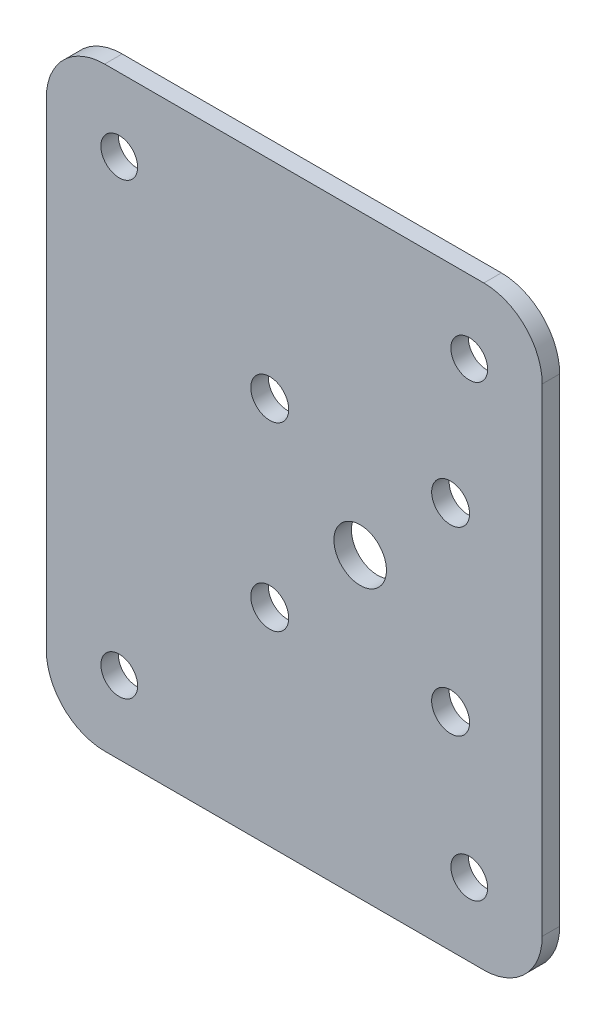
ISO-10303-21;
HEADER;
FILE_DESCRIPTION(('STEP AP214'),'2;1');
FILE_NAME('part.step','',(''),(''),'','','');
FILE_SCHEMA(('AUTOMOTIVE_DESIGN { 1 0 10303 214 1 1 1 1 }'));
ENDSEC;
DATA;
#1=APPLICATION_CONTEXT('core data for automotive mechanical design processes');
#2=APPLICATION_PROTOCOL_DEFINITION('international standard','automotive_design',2000,#1);
#3=PRODUCT_CONTEXT('',#1,'mechanical');
#4=PRODUCT('Part','Part','',(#3));
#5=PRODUCT_RELATED_PRODUCT_CATEGORY('part','',(#4));
#6=PRODUCT_DEFINITION_FORMATION('','',#4);
#7=PRODUCT_DEFINITION_CONTEXT('part definition',#1,'design');
#8=PRODUCT_DEFINITION('design','',#6,#7);
#9=PRODUCT_DEFINITION_SHAPE('','',#8);
#10=(LENGTH_UNIT() NAMED_UNIT(*) SI_UNIT(.MILLI.,.METRE.));
#11=(NAMED_UNIT(*) PLANE_ANGLE_UNIT() SI_UNIT($,.RADIAN.));
#12=(NAMED_UNIT(*) SI_UNIT($,.STERADIAN.) SOLID_ANGLE_UNIT());
#13=UNCERTAINTY_MEASURE_WITH_UNIT(LENGTH_MEASURE(1.E-05),#10,'distance_accuracy_value','');
#14=(GEOMETRIC_REPRESENTATION_CONTEXT(3) GLOBAL_UNCERTAINTY_ASSIGNED_CONTEXT((#13)) GLOBAL_UNIT_ASSIGNED_CONTEXT((#10,
#11,#12)) REPRESENTATION_CONTEXT('',''));
#15=CARTESIAN_POINT('',(0.,0.,0.));
#16=DIRECTION('',(0.,0.,1.));
#17=DIRECTION('',(1.,0.,0.));
#18=AXIS2_PLACEMENT_3D('',#15,#16,#17);
#19=CARTESIAN_POINT('',(0.,0.,3.));
#20=DIRECTION('',(0.,0.,1.));
#21=DIRECTION('',(1.,0.,0.));
#22=AXIS2_PLACEMENT_3D('',#19,#20,#21);
#23=PLANE('',#22);
#24=CARTESIAN_POINT('',(18.7,-38.5,3.));
#25=DIRECTION('',(0.,0.,1.));
#26=DIRECTION('',(-1.,0.,0.));
#27=AXIS2_PLACEMENT_3D('',#24,#25,#26);
#28=CIRCLE('',#27,3.15);
#29=CARTESIAN_POINT('',(15.55,-38.5,3.));
#30=VERTEX_POINT('',#29);
#31=EDGE_CURVE('E233',#30,#30,#28,.T.);
#32=ORIENTED_EDGE('',*,*,#31,.F.);
#33=EDGE_LOOP('',(#32));
#34=FACE_BOUND('',#33,.T.);
#35=CARTESIAN_POINT('',(-41.3,38.5,3.));
#36=DIRECTION('',(0.,0.,1.));
#37=DIRECTION('',(1.,0.,0.));
#38=AXIS2_PLACEMENT_3D('',#35,#36,#37);
#39=CIRCLE('',#38,3.15);
#40=CARTESIAN_POINT('',(-38.15,38.5,3.));
#41=VERTEX_POINT('',#40);
#42=EDGE_CURVE('E221',#41,#41,#39,.T.);
#43=ORIENTED_EDGE('',*,*,#42,.F.);
#44=EDGE_LOOP('',(#43));
#45=FACE_BOUND('',#44,.T.);
#46=CARTESIAN_POINT('',(15.5,-15.5,3.));
#47=DIRECTION('',(0.,0.,1.));
#48=DIRECTION('',(-1.,0.,0.));
#49=AXIS2_PLACEMENT_3D('',#46,#47,#48);
#50=CIRCLE('',#49,3.25);
#51=CARTESIAN_POINT('',(12.25,-15.5,3.));
#52=VERTEX_POINT('',#51);
#53=EDGE_CURVE('E209',#52,#52,#50,.T.);
#54=ORIENTED_EDGE('',*,*,#53,.F.);
#55=EDGE_LOOP('',(#54));
#56=FACE_BOUND('',#55,.T.);
#57=CARTESIAN_POINT('',(15.5,15.5,3.));
#58=DIRECTION('',(0.,0.,1.));
#59=DIRECTION('',(1.,0.,0.));
#60=AXIS2_PLACEMENT_3D('',#57,#58,#59);
#61=CIRCLE('',#60,3.25);
#62=CARTESIAN_POINT('',(18.75,15.5,3.));
#63=VERTEX_POINT('',#62);
#64=EDGE_CURVE('E197',#63,#63,#61,.T.);
#65=ORIENTED_EDGE('',*,*,#64,.F.);
#66=EDGE_LOOP('',(#65));
#67=FACE_BOUND('',#66,.T.);
#68=DIRECTION('',(0.,-1.,0.));
#69=VECTOR('',#68,1.);
#70=CARTESIAN_POINT('',(-53.8,51.,3.));
#71=LINE('',#70,#69);
#72=CARTESIAN_POINT('',(-53.8,41.,3.));
#73=VERTEX_POINT('',#72);
#74=CARTESIAN_POINT('',(-53.8,-41.,3.));
#75=VERTEX_POINT('',#74);
#76=EDGE_CURVE('E151',#73,#75,#71,.T.);
#77=ORIENTED_EDGE('',*,*,#76,.T.);
#78=CARTESIAN_POINT('',(-43.8,-41.,3.));
#79=DIRECTION('',(0.,0.,1.));
#80=DIRECTION('',(1.,0.,0.));
#81=AXIS2_PLACEMENT_3D('',#78,#79,#80);
#82=CIRCLE('',#81,10.);
#83=CARTESIAN_POINT('',(-43.8,-51.,3.));
#84=VERTEX_POINT('',#83);
#85=EDGE_CURVE('E165',#75,#84,#82,.T.);
#86=ORIENTED_EDGE('',*,*,#85,.T.);
#87=DIRECTION('',(1.,0.,0.));
#88=VECTOR('',#87,1.);
#89=CARTESIAN_POINT('',(-53.8,-51.,3.));
#90=LINE('',#89,#88);
#91=CARTESIAN_POINT('',(21.2,-51.,3.));
#92=VERTEX_POINT('',#91);
#93=EDGE_CURVE('E132',#84,#92,#90,.T.);
#94=ORIENTED_EDGE('',*,*,#93,.T.);
#95=CARTESIAN_POINT('',(21.2,-41.,3.));
#96=DIRECTION('',(0.,0.,1.));
#97=DIRECTION('',(1.,0.,0.));
#98=AXIS2_PLACEMENT_3D('',#95,#96,#97);
#99=CIRCLE('',#98,10.);
#100=CARTESIAN_POINT('',(31.2,-41.,3.));
#101=VERTEX_POINT('',#100);
#102=EDGE_CURVE('E161',#92,#101,#99,.T.);
#103=ORIENTED_EDGE('',*,*,#102,.T.);
#104=DIRECTION('',(0.,1.,0.));
#105=VECTOR('',#104,1.);
#106=CARTESIAN_POINT('',(31.2,51.,3.));
#107=LINE('',#106,#105);
#108=CARTESIAN_POINT('',(31.2,41.,3.));
#109=VERTEX_POINT('',#108);
#110=EDGE_CURVE('E174',#101,#109,#107,.T.);
#111=ORIENTED_EDGE('',*,*,#110,.T.);
#112=CARTESIAN_POINT('',(21.2,41.,3.));
#113=DIRECTION('',(0.,0.,1.));
#114=DIRECTION('',(1.,0.,0.));
#115=AXIS2_PLACEMENT_3D('',#112,#113,#114);
#116=CIRCLE('',#115,10.);
#117=CARTESIAN_POINT('',(21.2,51.,3.));
#118=VERTEX_POINT('',#117);
#119=EDGE_CURVE('E67',#109,#118,#116,.T.);
#120=ORIENTED_EDGE('',*,*,#119,.T.);
#121=DIRECTION('',(-1.,0.,0.));
#122=VECTOR('',#121,1.);
#123=CARTESIAN_POINT('',(-53.8,51.,3.));
#124=LINE('',#123,#122);
#125=CARTESIAN_POINT('',(-43.8,51.,3.));
#126=VERTEX_POINT('',#125);
#127=EDGE_CURVE('E152',#118,#126,#124,.T.);
#128=ORIENTED_EDGE('',*,*,#127,.T.);
#129=CARTESIAN_POINT('',(-43.8,41.,3.));
#130=DIRECTION('',(0.,0.,1.));
#131=DIRECTION('',(1.,0.,0.));
#132=AXIS2_PLACEMENT_3D('',#129,#130,#131);
#133=CIRCLE('',#132,10.);
#134=EDGE_CURVE('E163',#126,#73,#133,.T.);
#135=ORIENTED_EDGE('',*,*,#134,.T.);
#136=EDGE_LOOP('',(#77,#86,#94,#103,#111,#120,#128,#135));
#137=FACE_BOUND('',#136,.T.);
#138=CARTESIAN_POINT('',(0.,0.,3.));
#139=DIRECTION('',(0.,0.,1.));
#140=DIRECTION('',(1.,0.,0.));
#141=AXIS2_PLACEMENT_3D('',#138,#139,#140);
#142=CIRCLE('',#141,4.5);
#143=CARTESIAN_POINT('',(4.5,0.,3.));
#144=VERTEX_POINT('',#143);
#145=EDGE_CURVE('E146',#144,#144,#142,.T.);
#146=ORIENTED_EDGE('',*,*,#145,.F.);
#147=EDGE_LOOP('',(#146));
#148=FACE_BOUND('',#147,.T.);
#149=CARTESIAN_POINT('',(-15.5,15.5,3.));
#150=DIRECTION('',(0.,0.,1.));
#151=DIRECTION('',(-1.,0.,0.));
#152=AXIS2_PLACEMENT_3D('',#149,#150,#151);
#153=CIRCLE('',#152,3.25);
#154=CARTESIAN_POINT('',(-18.75,15.5,3.));
#155=VERTEX_POINT('',#154);
#156=EDGE_CURVE('E203',#155,#155,#153,.T.);
#157=ORIENTED_EDGE('',*,*,#156,.F.);
#158=EDGE_LOOP('',(#157));
#159=FACE_BOUND('',#158,.T.);
#160=CARTESIAN_POINT('',(-15.5,-15.5,3.));
#161=DIRECTION('',(0.,0.,1.));
#162=DIRECTION('',(1.,0.,0.));
#163=AXIS2_PLACEMENT_3D('',#160,#161,#162);
#164=CIRCLE('',#163,3.25);
#165=CARTESIAN_POINT('',(-12.25,-15.5,3.));
#166=VERTEX_POINT('',#165);
#167=EDGE_CURVE('E215',#166,#166,#164,.T.);
#168=ORIENTED_EDGE('',*,*,#167,.F.);
#169=EDGE_LOOP('',(#168));
#170=FACE_BOUND('',#169,.T.);
#171=CARTESIAN_POINT('',(18.7,38.5,3.));
#172=DIRECTION('',(0.,0.,1.));
#173=DIRECTION('',(1.,0.,0.));
#174=AXIS2_PLACEMENT_3D('',#171,#172,#173);
#175=CIRCLE('',#174,3.15);
#176=CARTESIAN_POINT('',(21.85,38.5,3.));
#177=VERTEX_POINT('',#176);
#178=EDGE_CURVE('E227',#177,#177,#175,.T.);
#179=ORIENTED_EDGE('',*,*,#178,.F.);
#180=EDGE_LOOP('',(#179));
#181=FACE_BOUND('',#180,.T.);
#182=CARTESIAN_POINT('',(-41.3,-38.5,3.));
#183=DIRECTION('',(0.,0.,1.));
#184=DIRECTION('',(-1.,0.,0.));
#185=AXIS2_PLACEMENT_3D('',#182,#183,#184);
#186=CIRCLE('',#185,3.15);
#187=CARTESIAN_POINT('',(-44.45,-38.5,3.));
#188=VERTEX_POINT('',#187);
#189=EDGE_CURVE('E239',#188,#188,#186,.T.);
#190=ORIENTED_EDGE('',*,*,#189,.F.);
#191=EDGE_LOOP('',(#190));
#192=FACE_BOUND('',#191,.T.);
#193=ADVANCED_FACE('F45',(#34,#45,#56,#67,#137,#148,#159,#170,#181,#192),#23,.T.);
#194=CARTESIAN_POINT('',(0.,0.,0.));
#195=DIRECTION('',(0.,0.,1.));
#196=DIRECTION('',(1.,0.,0.));
#197=AXIS2_PLACEMENT_3D('',#194,#195,#196);
#198=PLANE('',#197);
#199=DIRECTION('',(1.,0.,0.));
#200=VECTOR('',#199,1.);
#201=CARTESIAN_POINT('',(-53.8,-51.,0.));
#202=LINE('',#201,#200);
#203=CARTESIAN_POINT('',(-43.8,-51.,0.));
#204=VERTEX_POINT('',#203);
#205=CARTESIAN_POINT('',(21.2,-51.,0.));
#206=VERTEX_POINT('',#205);
#207=EDGE_CURVE('E129',#204,#206,#202,.T.);
#208=ORIENTED_EDGE('',*,*,#207,.F.);
#209=CARTESIAN_POINT('',(-43.8,-41.,0.));
#210=DIRECTION('',(0.,0.,1.));
#211=DIRECTION('',(1.,0.,0.));
#212=AXIS2_PLACEMENT_3D('',#209,#210,#211);
#213=CIRCLE('',#212,10.);
#214=CARTESIAN_POINT('',(-53.8,-41.,0.));
#215=VERTEX_POINT('',#214);
#216=EDGE_CURVE('E112',#204,#215,#213,.F.);
#217=ORIENTED_EDGE('',*,*,#216,.T.);
#218=DIRECTION('',(0.,-1.,0.));
#219=VECTOR('',#218,1.);
#220=CARTESIAN_POINT('',(-53.8,51.,0.));
#221=LINE('',#220,#219);
#222=CARTESIAN_POINT('',(-53.8,41.,0.));
#223=VERTEX_POINT('',#222);
#224=EDGE_CURVE('E141',#223,#215,#221,.T.);
#225=ORIENTED_EDGE('',*,*,#224,.F.);
#226=CARTESIAN_POINT('',(-43.8,41.,0.));
#227=DIRECTION('',(0.,0.,1.));
#228=DIRECTION('',(1.,0.,0.));
#229=AXIS2_PLACEMENT_3D('',#226,#227,#228);
#230=CIRCLE('',#229,10.);
#231=CARTESIAN_POINT('',(-43.8,51.,0.));
#232=VERTEX_POINT('',#231);
#233=EDGE_CURVE('E123',#223,#232,#230,.F.);
#234=ORIENTED_EDGE('',*,*,#233,.T.);
#235=DIRECTION('',(-1.,0.,0.));
#236=VECTOR('',#235,1.);
#237=CARTESIAN_POINT('',(-53.8,51.,0.));
#238=LINE('',#237,#236);
#239=CARTESIAN_POINT('',(21.2,51.,0.));
#240=VERTEX_POINT('',#239);
#241=EDGE_CURVE('E144',#240,#232,#238,.T.);
#242=ORIENTED_EDGE('',*,*,#241,.F.);
#243=CARTESIAN_POINT('',(21.2,41.,0.));
#244=DIRECTION('',(0.,0.,1.));
#245=DIRECTION('',(1.,0.,0.));
#246=AXIS2_PLACEMENT_3D('',#243,#244,#245);
#247=CIRCLE('',#246,10.);
#248=CARTESIAN_POINT('',(31.2,41.,0.));
#249=VERTEX_POINT('',#248);
#250=EDGE_CURVE('E133',#240,#249,#247,.F.);
#251=ORIENTED_EDGE('',*,*,#250,.T.);
#252=DIRECTION('',(0.,1.,0.));
#253=VECTOR('',#252,1.);
#254=CARTESIAN_POINT('',(31.2,51.,0.));
#255=LINE('',#254,#253);
#256=CARTESIAN_POINT('',(31.2,-41.,0.));
#257=VERTEX_POINT('',#256);
#258=EDGE_CURVE('E140',#257,#249,#255,.T.);
#259=ORIENTED_EDGE('',*,*,#258,.F.);
#260=CARTESIAN_POINT('',(21.2,-41.,0.));
#261=DIRECTION('',(0.,0.,1.));
#262=DIRECTION('',(1.,0.,0.));
#263=AXIS2_PLACEMENT_3D('',#260,#261,#262);
#264=CIRCLE('',#263,10.);
#265=EDGE_CURVE('E139',#257,#206,#264,.F.);
#266=ORIENTED_EDGE('',*,*,#265,.T.);
#267=EDGE_LOOP('',(#208,#217,#225,#234,#242,#251,#259,#266));
#268=FACE_BOUND('',#267,.T.);
#269=CARTESIAN_POINT('',(0.,0.,0.));
#270=DIRECTION('',(0.,0.,1.));
#271=DIRECTION('',(1.,0.,0.));
#272=AXIS2_PLACEMENT_3D('',#269,#270,#271);
#273=CIRCLE('',#272,4.5);
#274=CARTESIAN_POINT('',(4.5,0.,0.));
#275=VERTEX_POINT('',#274);
#276=EDGE_CURVE('E194',#275,#275,#273,.T.);
#277=ORIENTED_EDGE('',*,*,#276,.T.);
#278=EDGE_LOOP('',(#277));
#279=FACE_BOUND('',#278,.T.);
#280=CARTESIAN_POINT('',(15.5,15.5,0.));
#281=DIRECTION('',(0.,0.,1.));
#282=DIRECTION('',(1.,0.,0.));
#283=AXIS2_PLACEMENT_3D('',#280,#281,#282);
#284=CIRCLE('',#283,3.25);
#285=CARTESIAN_POINT('',(18.75,15.5,0.));
#286=VERTEX_POINT('',#285);
#287=EDGE_CURVE('E200',#286,#286,#284,.T.);
#288=ORIENTED_EDGE('',*,*,#287,.T.);
#289=EDGE_LOOP('',(#288));
#290=FACE_BOUND('',#289,.T.);
#291=CARTESIAN_POINT('',(-15.5,15.5,0.));
#292=DIRECTION('',(0.,0.,1.));
#293=DIRECTION('',(-1.,0.,0.));
#294=AXIS2_PLACEMENT_3D('',#291,#292,#293);
#295=CIRCLE('',#294,3.25);
#296=CARTESIAN_POINT('',(-18.75,15.5,0.));
#297=VERTEX_POINT('',#296);
#298=EDGE_CURVE('E206',#297,#297,#295,.T.);
#299=ORIENTED_EDGE('',*,*,#298,.T.);
#300=EDGE_LOOP('',(#299));
#301=FACE_BOUND('',#300,.T.);
#302=CARTESIAN_POINT('',(15.5,-15.5,0.));
#303=DIRECTION('',(0.,0.,1.));
#304=DIRECTION('',(-1.,0.,0.));
#305=AXIS2_PLACEMENT_3D('',#302,#303,#304);
#306=CIRCLE('',#305,3.25);
#307=CARTESIAN_POINT('',(12.25,-15.5,0.));
#308=VERTEX_POINT('',#307);
#309=EDGE_CURVE('E212',#308,#308,#306,.T.);
#310=ORIENTED_EDGE('',*,*,#309,.T.);
#311=EDGE_LOOP('',(#310));
#312=FACE_BOUND('',#311,.T.);
#313=CARTESIAN_POINT('',(-15.5,-15.5,0.));
#314=DIRECTION('',(0.,0.,1.));
#315=DIRECTION('',(1.,0.,0.));
#316=AXIS2_PLACEMENT_3D('',#313,#314,#315);
#317=CIRCLE('',#316,3.25);
#318=CARTESIAN_POINT('',(-12.25,-15.5,0.));
#319=VERTEX_POINT('',#318);
#320=EDGE_CURVE('E218',#319,#319,#317,.T.);
#321=ORIENTED_EDGE('',*,*,#320,.T.);
#322=EDGE_LOOP('',(#321));
#323=FACE_BOUND('',#322,.T.);
#324=CARTESIAN_POINT('',(-41.3,38.5,0.));
#325=DIRECTION('',(0.,0.,1.));
#326=DIRECTION('',(1.,0.,0.));
#327=AXIS2_PLACEMENT_3D('',#324,#325,#326);
#328=CIRCLE('',#327,3.15);
#329=CARTESIAN_POINT('',(-38.15,38.5,0.));
#330=VERTEX_POINT('',#329);
#331=EDGE_CURVE('E224',#330,#330,#328,.T.);
#332=ORIENTED_EDGE('',*,*,#331,.T.);
#333=EDGE_LOOP('',(#332));
#334=FACE_BOUND('',#333,.T.);
#335=CARTESIAN_POINT('',(18.7,38.5,0.));
#336=DIRECTION('',(0.,0.,1.));
#337=DIRECTION('',(1.,0.,0.));
#338=AXIS2_PLACEMENT_3D('',#335,#336,#337);
#339=CIRCLE('',#338,3.15);
#340=CARTESIAN_POINT('',(21.85,38.5,0.));
#341=VERTEX_POINT('',#340);
#342=EDGE_CURVE('E230',#341,#341,#339,.T.);
#343=ORIENTED_EDGE('',*,*,#342,.T.);
#344=EDGE_LOOP('',(#343));
#345=FACE_BOUND('',#344,.T.);
#346=CARTESIAN_POINT('',(18.7,-38.5,0.));
#347=DIRECTION('',(0.,0.,1.));
#348=DIRECTION('',(-1.,0.,0.));
#349=AXIS2_PLACEMENT_3D('',#346,#347,#348);
#350=CIRCLE('',#349,3.15);
#351=CARTESIAN_POINT('',(15.55,-38.5,0.));
#352=VERTEX_POINT('',#351);
#353=EDGE_CURVE('E236',#352,#352,#350,.T.);
#354=ORIENTED_EDGE('',*,*,#353,.T.);
#355=EDGE_LOOP('',(#354));
#356=FACE_BOUND('',#355,.T.);
#357=CARTESIAN_POINT('',(-41.3,-38.5,0.));
#358=DIRECTION('',(0.,0.,1.));
#359=DIRECTION('',(-1.,0.,0.));
#360=AXIS2_PLACEMENT_3D('',#357,#358,#359);
#361=CIRCLE('',#360,3.15);
#362=CARTESIAN_POINT('',(-44.45,-38.5,0.));
#363=VERTEX_POINT('',#362);
#364=EDGE_CURVE('E242',#363,#363,#361,.T.);
#365=ORIENTED_EDGE('',*,*,#364,.T.);
#366=EDGE_LOOP('',(#365));
#367=FACE_BOUND('',#366,.T.);
#368=ADVANCED_FACE('F136',(#268,#279,#290,#301,#312,#323,#334,#345,#356,#367),#198,.F.);
#369=CARTESIAN_POINT('',(-53.8,51.,3.));
#370=DIRECTION('',(1.,0.,0.));
#371=DIRECTION('',(0.,1.,0.));
#372=AXIS2_PLACEMENT_3D('',#369,#370,#371);
#373=PLANE('',#372);
#374=ORIENTED_EDGE('',*,*,#224,.T.);
#375=DIRECTION('',(0.,0.,-1.));
#376=VECTOR('',#375,1.);
#377=CARTESIAN_POINT('',(-53.8,-41.,3.));
#378=LINE('',#377,#376);
#379=EDGE_CURVE('E117',#215,#75,#378,.F.);
#380=ORIENTED_EDGE('',*,*,#379,.T.);
#381=ORIENTED_EDGE('',*,*,#76,.F.);
#382=DIRECTION('',(0.,0.,-1.));
#383=VECTOR('',#382,1.);
#384=CARTESIAN_POINT('',(-53.8,41.,3.));
#385=LINE('',#384,#383);
#386=EDGE_CURVE('E122',#73,#223,#385,.T.);
#387=ORIENTED_EDGE('',*,*,#386,.T.);
#388=EDGE_LOOP('',(#374,#380,#381,#387));
#389=FACE_BOUND('',#388,.T.);
#390=ADVANCED_FACE('F190',(#389),#373,.F.);
#391=CARTESIAN_POINT('',(-53.8,-51.,3.));
#392=DIRECTION('',(0.,1.,0.));
#393=DIRECTION('',(0.,0.,1.));
#394=AXIS2_PLACEMENT_3D('',#391,#392,#393);
#395=PLANE('',#394);
#396=ORIENTED_EDGE('',*,*,#93,.F.);
#397=DIRECTION('',(0.,0.,-1.));
#398=VECTOR('',#397,1.);
#399=CARTESIAN_POINT('',(-43.8,-51.,3.));
#400=LINE('',#399,#398);
#401=EDGE_CURVE('E116',#84,#204,#400,.T.);
#402=ORIENTED_EDGE('',*,*,#401,.T.);
#403=ORIENTED_EDGE('',*,*,#207,.T.);
#404=DIRECTION('',(0.,0.,-1.));
#405=VECTOR('',#404,1.);
#406=CARTESIAN_POINT('',(21.2,-51.,3.));
#407=LINE('',#406,#405);
#408=EDGE_CURVE('E134',#206,#92,#407,.F.);
#409=ORIENTED_EDGE('',*,*,#408,.T.);
#410=EDGE_LOOP('',(#396,#402,#403,#409));
#411=FACE_BOUND('',#410,.T.);
#412=ADVANCED_FACE('F128',(#411),#395,.F.);
#413=CARTESIAN_POINT('',(31.2,51.,3.));
#414=DIRECTION('',(-1.,0.,0.));
#415=DIRECTION('',(0.,-1.,0.));
#416=AXIS2_PLACEMENT_3D('',#413,#414,#415);
#417=PLANE('',#416);
#418=ORIENTED_EDGE('',*,*,#110,.F.);
#419=DIRECTION('',(0.,0.,-1.));
#420=VECTOR('',#419,1.);
#421=CARTESIAN_POINT('',(31.2,-41.,3.));
#422=LINE('',#421,#420);
#423=EDGE_CURVE('E13',#101,#257,#422,.T.);
#424=ORIENTED_EDGE('',*,*,#423,.T.);
#425=ORIENTED_EDGE('',*,*,#258,.T.);
#426=DIRECTION('',(0.,0.,-1.));
#427=VECTOR('',#426,1.);
#428=CARTESIAN_POINT('',(31.2,41.,3.));
#429=LINE('',#428,#427);
#430=EDGE_CURVE('E53',#249,#109,#429,.F.);
#431=ORIENTED_EDGE('',*,*,#430,.T.);
#432=EDGE_LOOP('',(#418,#424,#425,#431));
#433=FACE_BOUND('',#432,.T.);
#434=ADVANCED_FACE('F173',(#433),#417,.F.);
#435=CARTESIAN_POINT('',(-53.8,51.,3.));
#436=DIRECTION('',(0.,-1.,0.));
#437=DIRECTION('',(0.,0.,-1.));
#438=AXIS2_PLACEMENT_3D('',#435,#436,#437);
#439=PLANE('',#438);
#440=ORIENTED_EDGE('',*,*,#241,.T.);
#441=DIRECTION('',(0.,0.,-1.));
#442=VECTOR('',#441,1.);
#443=CARTESIAN_POINT('',(-43.8,51.,3.));
#444=LINE('',#443,#442);
#445=EDGE_CURVE('E60',#232,#126,#444,.F.);
#446=ORIENTED_EDGE('',*,*,#445,.T.);
#447=ORIENTED_EDGE('',*,*,#127,.F.);
#448=DIRECTION('',(0.,0.,-1.));
#449=VECTOR('',#448,1.);
#450=CARTESIAN_POINT('',(21.2,51.,3.));
#451=LINE('',#450,#449);
#452=EDGE_CURVE('E167',#118,#240,#451,.T.);
#453=ORIENTED_EDGE('',*,*,#452,.T.);
#454=EDGE_LOOP('',(#440,#446,#447,#453));
#455=FACE_BOUND('',#454,.T.);
#456=ADVANCED_FACE('F183',(#455),#439,.F.);
#457=CARTESIAN_POINT('',(0.,0.,3.));
#458=DIRECTION('',(0.,0.,-1.));
#459=DIRECTION('',(-1.,0.,0.));
#460=AXIS2_PLACEMENT_3D('',#457,#458,#459);
#461=CYLINDRICAL_SURFACE('',#460,4.5);
#462=ORIENTED_EDGE('',*,*,#145,.T.);
#463=EDGE_LOOP('',(#462));
#464=FACE_BOUND('',#463,.T.);
#465=ORIENTED_EDGE('',*,*,#276,.F.);
#466=EDGE_LOOP('',(#465));
#467=FACE_BOUND('',#466,.T.);
#468=ADVANCED_FACE('F261',(#464,#467),#461,.F.);
#469=CARTESIAN_POINT('',(15.5,15.5,3.));
#470=DIRECTION('',(0.,0.,-1.));
#471=DIRECTION('',(-1.,0.,0.));
#472=AXIS2_PLACEMENT_3D('',#469,#470,#471);
#473=CYLINDRICAL_SURFACE('',#472,3.25);
#474=ORIENTED_EDGE('',*,*,#64,.T.);
#475=EDGE_LOOP('',(#474));
#476=FACE_BOUND('',#475,.T.);
#477=ORIENTED_EDGE('',*,*,#287,.F.);
#478=EDGE_LOOP('',(#477));
#479=FACE_BOUND('',#478,.T.);
#480=ADVANCED_FACE('F403',(#476,#479),#473,.F.);
#481=CARTESIAN_POINT('',(-15.5,15.5,3.));
#482=DIRECTION('',(0.,0.,-1.));
#483=DIRECTION('',(-1.,0.,0.));
#484=AXIS2_PLACEMENT_3D('',#481,#482,#483);
#485=CYLINDRICAL_SURFACE('',#484,3.25);
#486=ORIENTED_EDGE('',*,*,#156,.T.);
#487=EDGE_LOOP('',(#486));
#488=FACE_BOUND('',#487,.T.);
#489=ORIENTED_EDGE('',*,*,#298,.F.);
#490=EDGE_LOOP('',(#489));
#491=FACE_BOUND('',#490,.T.);
#492=ADVANCED_FACE('F393',(#488,#491),#485,.F.);
#493=CARTESIAN_POINT('',(15.5,-15.5,3.));
#494=DIRECTION('',(0.,0.,-1.));
#495=DIRECTION('',(-1.,0.,0.));
#496=AXIS2_PLACEMENT_3D('',#493,#494,#495);
#497=CYLINDRICAL_SURFACE('',#496,3.25);
#498=ORIENTED_EDGE('',*,*,#53,.T.);
#499=EDGE_LOOP('',(#498));
#500=FACE_BOUND('',#499,.T.);
#501=ORIENTED_EDGE('',*,*,#309,.F.);
#502=EDGE_LOOP('',(#501));
#503=FACE_BOUND('',#502,.T.);
#504=ADVANCED_FACE('F383',(#500,#503),#497,.F.);
#505=CARTESIAN_POINT('',(-15.5,-15.5,3.));
#506=DIRECTION('',(0.,0.,-1.));
#507=DIRECTION('',(-1.,0.,0.));
#508=AXIS2_PLACEMENT_3D('',#505,#506,#507);
#509=CYLINDRICAL_SURFACE('',#508,3.25);
#510=ORIENTED_EDGE('',*,*,#167,.T.);
#511=EDGE_LOOP('',(#510));
#512=FACE_BOUND('',#511,.T.);
#513=ORIENTED_EDGE('',*,*,#320,.F.);
#514=EDGE_LOOP('',(#513));
#515=FACE_BOUND('',#514,.T.);
#516=ADVANCED_FACE('F373',(#512,#515),#509,.F.);
#517=CARTESIAN_POINT('',(-41.3,38.5,3.));
#518=DIRECTION('',(0.,0.,-1.));
#519=DIRECTION('',(-1.,0.,0.));
#520=AXIS2_PLACEMENT_3D('',#517,#518,#519);
#521=CYLINDRICAL_SURFACE('',#520,3.15);
#522=ORIENTED_EDGE('',*,*,#42,.T.);
#523=EDGE_LOOP('',(#522));
#524=FACE_BOUND('',#523,.T.);
#525=ORIENTED_EDGE('',*,*,#331,.F.);
#526=EDGE_LOOP('',(#525));
#527=FACE_BOUND('',#526,.T.);
#528=ADVANCED_FACE('F363',(#524,#527),#521,.F.);
#529=CARTESIAN_POINT('',(18.7,38.5,3.));
#530=DIRECTION('',(0.,0.,-1.));
#531=DIRECTION('',(-1.,0.,0.));
#532=AXIS2_PLACEMENT_3D('',#529,#530,#531);
#533=CYLINDRICAL_SURFACE('',#532,3.15);
#534=ORIENTED_EDGE('',*,*,#178,.T.);
#535=EDGE_LOOP('',(#534));
#536=FACE_BOUND('',#535,.T.);
#537=ORIENTED_EDGE('',*,*,#342,.F.);
#538=EDGE_LOOP('',(#537));
#539=FACE_BOUND('',#538,.T.);
#540=ADVANCED_FACE('F353',(#536,#539),#533,.F.);
#541=CARTESIAN_POINT('',(18.7,-38.5,3.));
#542=DIRECTION('',(0.,0.,-1.));
#543=DIRECTION('',(-1.,0.,0.));
#544=AXIS2_PLACEMENT_3D('',#541,#542,#543);
#545=CYLINDRICAL_SURFACE('',#544,3.15);
#546=ORIENTED_EDGE('',*,*,#31,.T.);
#547=EDGE_LOOP('',(#546));
#548=FACE_BOUND('',#547,.T.);
#549=ORIENTED_EDGE('',*,*,#353,.F.);
#550=EDGE_LOOP('',(#549));
#551=FACE_BOUND('',#550,.T.);
#552=ADVANCED_FACE('F344',(#548,#551),#545,.F.);
#553=CARTESIAN_POINT('',(-41.3,-38.5,3.));
#554=DIRECTION('',(0.,0.,-1.));
#555=DIRECTION('',(-1.,0.,0.));
#556=AXIS2_PLACEMENT_3D('',#553,#554,#555);
#557=CYLINDRICAL_SURFACE('',#556,3.15);
#558=ORIENTED_EDGE('',*,*,#189,.T.);
#559=EDGE_LOOP('',(#558));
#560=FACE_BOUND('',#559,.T.);
#561=ORIENTED_EDGE('',*,*,#364,.F.);
#562=EDGE_LOOP('',(#561));
#563=FACE_BOUND('',#562,.T.);
#564=ADVANCED_FACE('F248',(#560,#563),#557,.F.);
#565=CARTESIAN_POINT('',(-43.8,-41.,3.));
#566=DIRECTION('',(0.,0.,-1.));
#567=DIRECTION('',(-1.,0.,0.));
#568=AXIS2_PLACEMENT_3D('',#565,#566,#567);
#569=CYLINDRICAL_SURFACE('',#568,10.);
#570=ORIENTED_EDGE('',*,*,#85,.F.);
#571=ORIENTED_EDGE('',*,*,#379,.F.);
#572=ORIENTED_EDGE('',*,*,#216,.F.);
#573=ORIENTED_EDGE('',*,*,#401,.F.);
#574=EDGE_LOOP('',(#570,#571,#572,#573));
#575=FACE_BOUND('',#574,.T.);
#576=ADVANCED_FACE('F115',(#575),#569,.T.);
#577=CARTESIAN_POINT('',(-43.8,41.,3.));
#578=DIRECTION('',(0.,0.,-1.));
#579=DIRECTION('',(-1.,0.,0.));
#580=AXIS2_PLACEMENT_3D('',#577,#578,#579);
#581=CYLINDRICAL_SURFACE('',#580,10.);
#582=ORIENTED_EDGE('',*,*,#134,.F.);
#583=ORIENTED_EDGE('',*,*,#445,.F.);
#584=ORIENTED_EDGE('',*,*,#233,.F.);
#585=ORIENTED_EDGE('',*,*,#386,.F.);
#586=EDGE_LOOP('',(#582,#583,#584,#585));
#587=FACE_BOUND('',#586,.T.);
#588=ADVANCED_FACE('F187',(#587),#581,.T.);
#589=CARTESIAN_POINT('',(21.2,-41.,3.));
#590=DIRECTION('',(0.,0.,-1.));
#591=DIRECTION('',(-1.,0.,0.));
#592=AXIS2_PLACEMENT_3D('',#589,#590,#591);
#593=CYLINDRICAL_SURFACE('',#592,10.);
#594=ORIENTED_EDGE('',*,*,#102,.F.);
#595=ORIENTED_EDGE('',*,*,#408,.F.);
#596=ORIENTED_EDGE('',*,*,#265,.F.);
#597=ORIENTED_EDGE('',*,*,#423,.F.);
#598=EDGE_LOOP('',(#594,#595,#596,#597));
#599=FACE_BOUND('',#598,.T.);
#600=ADVANCED_FACE('F275',(#599),#593,.T.);
#601=CARTESIAN_POINT('',(21.2,41.,3.));
#602=DIRECTION('',(0.,0.,-1.));
#603=DIRECTION('',(-1.,0.,0.));
#604=AXIS2_PLACEMENT_3D('',#601,#602,#603);
#605=CYLINDRICAL_SURFACE('',#604,10.);
#606=ORIENTED_EDGE('',*,*,#119,.F.);
#607=ORIENTED_EDGE('',*,*,#430,.F.);
#608=ORIENTED_EDGE('',*,*,#250,.F.);
#609=ORIENTED_EDGE('',*,*,#452,.F.);
#610=EDGE_LOOP('',(#606,#607,#608,#609));
#611=FACE_BOUND('',#610,.T.);
#612=ADVANCED_FACE('F47',(#611),#605,.T.);
#613=CLOSED_SHELL('',(#193,#368,#390,#412,#434,#456,#468,#480,#492,#504,#516,#528,#540,#552,
#564,#576,#588,#600,#612));
#614=MANIFOLD_SOLID_BREP('B2',#613);
#615=ADVANCED_BREP_SHAPE_REPRESENTATION('',(#18,#614),#14);
#616=SHAPE_DEFINITION_REPRESENTATION(#9,#615);
ENDSEC;
END-ISO-10303-21;
